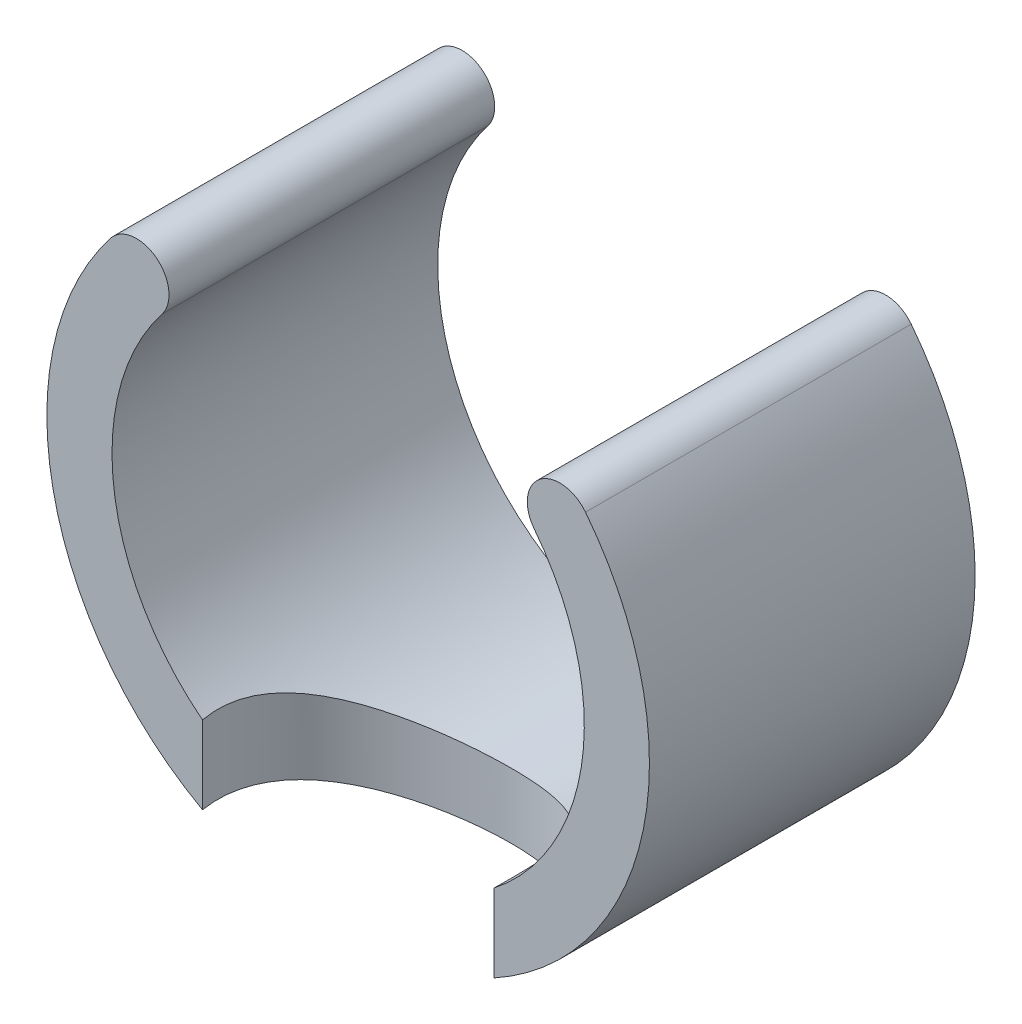
ISO-10303-21;
HEADER;
FILE_DESCRIPTION(('STEP AP214'),'2;1');
FILE_NAME('part.step','',(''),(''),'','','');
FILE_SCHEMA(('AUTOMOTIVE_DESIGN { 1 0 10303 214 1 1 1 1 }'));
ENDSEC;
DATA;
#1=APPLICATION_CONTEXT('core data for automotive mechanical design processes');
#2=APPLICATION_PROTOCOL_DEFINITION('international standard','automotive_design',2000,#1);
#3=PRODUCT_CONTEXT('',#1,'mechanical');
#4=PRODUCT('Part','Part','',(#3));
#5=PRODUCT_RELATED_PRODUCT_CATEGORY('part','',(#4));
#6=PRODUCT_DEFINITION_FORMATION('','',#4);
#7=PRODUCT_DEFINITION_CONTEXT('part definition',#1,'design');
#8=PRODUCT_DEFINITION('design','',#6,#7);
#9=PRODUCT_DEFINITION_SHAPE('','',#8);
#10=(LENGTH_UNIT() NAMED_UNIT(*) SI_UNIT(.MILLI.,.METRE.));
#11=(NAMED_UNIT(*) PLANE_ANGLE_UNIT() SI_UNIT($,.RADIAN.));
#12=(NAMED_UNIT(*) SI_UNIT($,.STERADIAN.) SOLID_ANGLE_UNIT());
#13=UNCERTAINTY_MEASURE_WITH_UNIT(LENGTH_MEASURE(1.E-05),#10,'distance_accuracy_value','');
#14=(GEOMETRIC_REPRESENTATION_CONTEXT(3) GLOBAL_UNCERTAINTY_ASSIGNED_CONTEXT((#13)) GLOBAL_UNIT_ASSIGNED_CONTEXT((#10,
#11,#12)) REPRESENTATION_CONTEXT('',''));
#15=CARTESIAN_POINT('',(0.,0.,0.));
#16=DIRECTION('',(0.,0.,1.));
#17=DIRECTION('',(1.,0.,0.));
#18=AXIS2_PLACEMENT_3D('',#15,#16,#17);
#19=CARTESIAN_POINT('',(-3.25,2.5403001791127,10.));
#20=DIRECTION('',(0.,0.,-1.));
#21=DIRECTION('',(-1.,0.,0.));
#22=AXIS2_PLACEMENT_3D('',#19,#20,#21);
#23=PLANE('',#22);
#24=CARTESIAN_POINT('',(0.,0.,10.));
#25=DIRECTION('',(0.,0.,-1.));
#26=DIRECTION('',(1.,0.,0.));
#27=AXIS2_PLACEMENT_3D('',#24,#25,#26);
#28=CIRCLE('',#27,7.25);
#29=CARTESIAN_POINT('',(5.71212121212121,4.46477001177383,10.));
#30=VERTEX_POINT('',#29);
#31=CARTESIAN_POINT('',(4.47213595499958,-5.70635610525667,10.));
#32=VERTEX_POINT('',#31);
#33=EDGE_CURVE('E116',#30,#32,#28,.T.);
#34=ORIENTED_EDGE('',*,*,#33,.T.);
#35=DIRECTION('',(0.,-1.,0.));
#36=VECTOR('',#35,1.);
#37=CARTESIAN_POINT('',(4.47213595499958,6.0806003582254,10.));
#38=LINE('',#37,#36);
#39=CARTESIAN_POINT('',(4.47213595499958,-8.09706737035083,10.));
#40=VERTEX_POINT('',#39);
#41=EDGE_CURVE('E11',#32,#40,#38,.T.);
#42=ORIENTED_EDGE('',*,*,#41,.T.);
#43=CARTESIAN_POINT('',(0.,0.,10.));
#44=DIRECTION('',(0.,0.,1.));
#45=DIRECTION('',(1.,0.,0.));
#46=AXIS2_PLACEMENT_3D('',#43,#44,#45);
#47=CIRCLE('',#46,9.25);
#48=CARTESIAN_POINT('',(7.28787878787879,5.69643070467696,10.));
#49=VERTEX_POINT('',#48);
#50=EDGE_CURVE('E104',#40,#49,#47,.T.);
#51=ORIENTED_EDGE('',*,*,#50,.T.);
#52=CARTESIAN_POINT('',(6.5,5.0806003582254,10.));
#53=DIRECTION('',(0.,0.,1.));
#54=DIRECTION('',(1.,0.,0.));
#55=AXIS2_PLACEMENT_3D('',#52,#53,#54);
#56=CIRCLE('',#55,1.);
#57=EDGE_CURVE('E111',#49,#30,#56,.T.);
#58=ORIENTED_EDGE('',*,*,#57,.T.);
#59=EDGE_LOOP('',(#34,#42,#51,#58));
#60=FACE_BOUND('',#59,.T.);
#61=ADVANCED_FACE('F37',(#60),#23,.F.);
#62=CARTESIAN_POINT('',(-6.5,5.0806003582254,10.));
#63=DIRECTION('',(0.,0.,-1.));
#64=DIRECTION('',(-1.,0.,0.));
#65=AXIS2_PLACEMENT_3D('',#62,#63,#64);
#66=CYLINDRICAL_SURFACE('',#65,1.);
#67=CARTESIAN_POINT('',(-6.5,5.0806003582254,0.));
#68=DIRECTION('',(0.,0.,1.));
#69=DIRECTION('',(-1.,0.,0.));
#70=AXIS2_PLACEMENT_3D('',#67,#68,#69);
#71=CIRCLE('',#70,1.);
#72=CARTESIAN_POINT('',(-5.71212121212121,4.46477001177383,0.));
#73=VERTEX_POINT('',#72);
#74=CARTESIAN_POINT('',(-7.28787878787879,5.69643070467696,0.));
#75=VERTEX_POINT('',#74);
#76=EDGE_CURVE('E105',#73,#75,#71,.T.);
#77=ORIENTED_EDGE('',*,*,#76,.T.);
#78=DIRECTION('',(0.,0.,-1.));
#79=VECTOR('',#78,1.);
#80=CARTESIAN_POINT('',(-7.28787878787879,5.69643070467696,10.));
#81=LINE('',#80,#79);
#82=CARTESIAN_POINT('',(-7.28787878787879,5.69643070467696,10.));
#83=VERTEX_POINT('',#82);
#84=EDGE_CURVE('E100',#83,#75,#81,.T.);
#85=ORIENTED_EDGE('',*,*,#84,.F.);
#86=CARTESIAN_POINT('',(-6.5,5.0806003582254,10.));
#87=DIRECTION('',(0.,0.,1.));
#88=DIRECTION('',(-1.,0.,0.));
#89=AXIS2_PLACEMENT_3D('',#86,#87,#88);
#90=CIRCLE('',#89,1.);
#91=CARTESIAN_POINT('',(-5.71212121212121,4.46477001177383,10.));
#92=VERTEX_POINT('',#91);
#93=EDGE_CURVE('E109',#92,#83,#90,.T.);
#94=ORIENTED_EDGE('',*,*,#93,.F.);
#95=DIRECTION('',(0.,0.,-1.));
#96=VECTOR('',#95,1.);
#97=CARTESIAN_POINT('',(-5.71212121212121,4.46477001177383,10.));
#98=LINE('',#97,#96);
#99=EDGE_CURVE('E119',#92,#73,#98,.T.);
#100=ORIENTED_EDGE('',*,*,#99,.T.);
#101=EDGE_LOOP('',(#77,#85,#94,#100));
#102=FACE_BOUND('',#101,.T.);
#103=ADVANCED_FACE('F39',(#102),#66,.T.);
#104=CARTESIAN_POINT('',(0.,0.,10.));
#105=DIRECTION('',(0.,0.,-1.));
#106=DIRECTION('',(-1.,0.,0.));
#107=AXIS2_PLACEMENT_3D('',#104,#105,#106);
#108=CYLINDRICAL_SURFACE('',#107,9.25);
#109=ORIENTED_EDGE('',*,*,#50,.F.);
#110=CARTESIAN_POINT('',(4.47213595499958,-8.09706737035083,10.));
#111=CARTESIAN_POINT('',(4.48489758006888,-8.08999882609131,9.88604254475511));
#112=CARTESIAN_POINT('',(4.49327965414798,-8.08534917688268,9.77144470022145));
#113=CARTESIAN_POINT('',(4.50126465970609,-8.08091732281667,9.54188039251851));
#114=CARTESIAN_POINT('',(4.5008699393526,-8.08113381605844,9.42691403617188));
#115=CARTESIAN_POINT('',(4.49131206083086,-8.08644680427386,9.19803520379959));
#116=CARTESIAN_POINT('',(4.48219265001421,-8.09151895209911,9.08412033140435));
#117=CARTESIAN_POINT('',(4.45537290876027,-8.1063179996134,8.85761605176528));
#118=CARTESIAN_POINT('',(4.43767249401744,-8.11604494503427,8.74502665755497));
#119=CARTESIAN_POINT('',(4.39391702856915,-8.1398163520152,8.5220490745522));
#120=CARTESIAN_POINT('',(4.36786917475545,-8.15385709393059,8.41165907627824));
#121=CARTESIAN_POINT('',(4.30769978982687,-8.18580334131056,8.19365865801574));
#122=CARTESIAN_POINT('',(4.27357512516452,-8.20371034652586,8.0860493348591));
#123=CARTESIAN_POINT('',(4.15951053821454,-8.26246523313206,7.76821147283342));
#124=CARTESIAN_POINT('',(4.06788213577147,-8.30834577312544,7.56298364529098));
#125=CARTESIAN_POINT('',(3.85053523659749,-8.41136413706981,7.15930372860976));
#126=CARTESIAN_POINT('',(3.72321939088373,-8.46898221170473,6.96184459338603));
#127=CARTESIAN_POINT('',(3.44015728464322,-8.5878649366188,6.58966619799807));
#128=CARTESIAN_POINT('',(3.28439652750061,-8.64913143549607,6.41495861102613));
#129=CARTESIAN_POINT('',(2.9293230165855,-8.77613795751267,6.07426012902534));
#130=CARTESIAN_POINT('',(2.72714973826912,-8.84166846450466,5.91113101947199));
#131=CARTESIAN_POINT('',(2.40388601416002,-8.93288673380512,5.69365431364808));
#132=CARTESIAN_POINT('',(2.29273082970407,-8.96212737206574,5.6256683499567));
#133=CARTESIAN_POINT('',(2.06435598221837,-9.01746646503543,5.49932088563788));
#134=CARTESIAN_POINT('',(1.94713932686477,-9.04356645713101,5.44095467080456));
#135=CARTESIAN_POINT('',(1.7097107319425,-9.09141225682448,5.3354540310262));
#136=CARTESIAN_POINT('',(1.58960056425818,-9.11323251197354,5.28812421444321));
#137=CARTESIAN_POINT('',(1.34516245979946,-9.15250497663014,5.20381102315654));
#138=CARTESIAN_POINT('',(1.22083656057016,-9.16995926306569,5.16682272791444));
#139=CARTESIAN_POINT('',(0.968947584015276,-9.1999848152553,5.10363860089762));
#140=CARTESIAN_POINT('',(0.841385929489183,-9.21255818887082,5.07743811002562));
#141=CARTESIAN_POINT('',(0.584073397738918,-9.23244291462036,5.03616409855269));
#142=CARTESIAN_POINT('',(0.454322738884087,-9.2397547884882,5.02108947469958));
#143=CARTESIAN_POINT('',(0.206293780403961,-9.24845063983486,5.0031798464544));
#144=CARTESIAN_POINT('',(0.0881063694657602,-9.25033511163145,4.9993112400217));
#145=CARTESIAN_POINT('',(-0.148233404857098,-9.24956717836308,5.00088961000329));
#146=CARTESIAN_POINT('',(-0.266385744268939,-9.24691329460922,5.00633962261384));
#147=CARTESIAN_POINT('',(-0.501650619846853,-9.23713713130681,5.02649136222737));
#148=CARTESIAN_POINT('',(-0.618763639467164,-9.230017053134,5.04118853134156));
#149=CARTESIAN_POINT('',(-0.85118565718089,-9.21149180783341,5.07966460262621));
#150=CARTESIAN_POINT('',(-0.966493955265756,-9.20008501889577,5.1034469420849));
#151=CARTESIAN_POINT('',(-1.19087392592476,-9.17369458835386,5.15894597007197));
#152=CARTESIAN_POINT('',(-1.3000277169505,-9.15883460127138,5.19038986362034));
#153=CARTESIAN_POINT('',(-1.51519967791583,-9.12570790686383,5.26124802855908));
#154=CARTESIAN_POINT('',(-1.6212167466451,-9.10744001918902,5.30066506190102));
#155=CARTESIAN_POINT('',(-1.9335945003063,-9.04812116348833,5.43036067253048));
#156=CARTESIAN_POINT('',(-2.13445461686193,-9.00253372771635,5.53212702777125));
#157=CARTESIAN_POINT('',(-2.53039979691018,-8.89968208304902,5.77116074421674));
#158=CARTESIAN_POINT('',(-2.72413828442333,-8.84183054143739,5.91038789964362));
#159=CARTESIAN_POINT('',(-3.08663868757161,-8.72190684654523,6.21684911347673));
#160=CARTESIAN_POINT('',(-3.25538352106138,-8.65983184860582,6.38410216155728));
#161=CARTESIAN_POINT('',(-3.57844740774304,-8.53170585408679,6.75934833749651));
#162=CARTESIAN_POINT('',(-3.73019412590928,-8.46578506548172,6.9696303856932));
#163=CARTESIAN_POINT('',(-3.92970069381427,-8.37408743899456,7.30356393606012));
#164=CARTESIAN_POINT('',(-3.99154679390264,-8.34470289744326,7.4180366341937));
#165=CARTESIAN_POINT('',(-4.10535056197327,-8.28930603657504,7.65255460179983));
#166=CARTESIAN_POINT('',(-4.15731331434438,-8.26329198555109,7.77259696625894));
#167=CARTESIAN_POINT('',(-4.24996027429379,-8.21602084904903,8.01527658763121));
#168=CARTESIAN_POINT('',(-4.29083258176016,-8.1946857864363,8.13782682312317));
#169=CARTESIAN_POINT('',(-4.36201569440226,-8.15701799991444,8.38664965219971));
#170=CARTESIAN_POINT('',(-4.39233220532143,-8.14068257412229,8.51292019467874));
#171=CARTESIAN_POINT('',(-4.44196101644163,-8.11370954803898,8.76799187359897));
#172=CARTESIAN_POINT('',(-4.46129133779871,-8.10306261837334,8.89678850517966));
#173=CARTESIAN_POINT('',(-4.48871106628602,-8.08790575866285,9.15586943414633));
#174=CARTESIAN_POINT('',(-4.49680734111596,-8.08339207921857,9.28615277350081));
#175=CARTESIAN_POINT('',(-4.5010350587087,-8.08103895534727,9.51406614366662));
#176=CARTESIAN_POINT('',(-4.49966900567461,-8.08180339651884,9.61164495716267));
#177=CARTESIAN_POINT('',(-4.49062151342671,-8.08682908994844,9.80629804118089));
#178=CARTESIAN_POINT('',(-4.48294789452147,-8.09108601211185,9.90337278676397));
#179=CARTESIAN_POINT('',(-4.47213595499958,-8.09706737035083,10.));
#180=B_SPLINE_CURVE_WITH_KNOTS('',3,(#110,#111,#112,#113,#114,#115,#116,#117,#118,#119,#120,
#121,#122,#123,#124,#125,#126,#127,#128,#129,#130,#131,#132,#133,#134,#135,#136,#137,#138,#139,
#140,#141,#142,#143,#144,#145,#146,#147,#148,#149,#150,#151,#152,#153,#154,#155,#156,#157,#158,
#159,#160,#161,#162,#163,#164,#165,#166,#167,#168,#169,#170,#171,#172,#173,#174,#175,#176,#177,
#178,#179),.UNSPECIFIED.,.F.,.F.,(4,2,2,2,2,2,2,2,2,2,2,2,2,2,2,2,2,2,2,2,2,2,2,2,2,2,2,2,2,2,2,
2,2,2,4),(0.,0.344553588946533,0.689014996195983,1.03175820783599,1.37450478688341,
1.71695665236772,2.0595415967713,2.74474374509819,3.46761973334347,4.19086516022898,
4.99037545093835,5.3905710108695,5.79056986606612,6.18283274947934,6.57490867373586,
6.96681508798233,7.35868263517121,7.7130345807285,8.06750200338289,8.42179484709775,
8.77622186712573,9.11951206032062,9.46292137592902,10.1492076655085,10.882679491147,
11.6166503243966,12.415145802642,12.8148876505698,13.2144232957968,13.6066855827062,
13.9987355090197,14.3901404676642,14.7813060434833,15.0738228464889,15.365977524488),.UNSPECIFIED.);
#181=CARTESIAN_POINT('',(-4.47213595499958,-8.09706737035083,10.));
#182=VERTEX_POINT('',#181);
#183=EDGE_CURVE('E99',#40,#182,#180,.T.);
#184=ORIENTED_EDGE('',*,*,#183,.T.);
#185=EDGE_CURVE('E90',#83,#182,#47,.T.);
#186=ORIENTED_EDGE('',*,*,#185,.F.);
#187=ORIENTED_EDGE('',*,*,#84,.T.);
#188=CARTESIAN_POINT('',(0.,0.,0.));
#189=DIRECTION('',(0.,0.,1.));
#190=DIRECTION('',(1.,0.,0.));
#191=AXIS2_PLACEMENT_3D('',#188,#189,#190);
#192=CIRCLE('',#191,9.25);
#193=CARTESIAN_POINT('',(7.28787878787879,5.69643070467696,0.));
#194=VERTEX_POINT('',#193);
#195=EDGE_CURVE('E122',#75,#194,#192,.T.);
#196=ORIENTED_EDGE('',*,*,#195,.T.);
#197=DIRECTION('',(0.,0.,-1.));
#198=VECTOR('',#197,1.);
#199=CARTESIAN_POINT('',(7.28787878787879,5.69643070467696,10.));
#200=LINE('',#199,#198);
#201=EDGE_CURVE('E130',#49,#194,#200,.T.);
#202=ORIENTED_EDGE('',*,*,#201,.F.);
#203=EDGE_LOOP('',(#109,#184,#186,#187,#196,#202));
#204=FACE_BOUND('',#203,.T.);
#205=ADVANCED_FACE('F102',(#204),#108,.T.);
#206=CARTESIAN_POINT('',(6.5,5.0806003582254,10.));
#207=DIRECTION('',(0.,0.,-1.));
#208=DIRECTION('',(-1.,0.,0.));
#209=AXIS2_PLACEMENT_3D('',#206,#207,#208);
#210=CYLINDRICAL_SURFACE('',#209,1.);
#211=CARTESIAN_POINT('',(6.5,5.0806003582254,0.));
#212=DIRECTION('',(0.,0.,1.));
#213=DIRECTION('',(1.,0.,0.));
#214=AXIS2_PLACEMENT_3D('',#211,#212,#213);
#215=CIRCLE('',#214,1.);
#216=CARTESIAN_POINT('',(5.71212121212121,4.46477001177383,0.));
#217=VERTEX_POINT('',#216);
#218=EDGE_CURVE('E124',#194,#217,#215,.T.);
#219=ORIENTED_EDGE('',*,*,#218,.T.);
#220=DIRECTION('',(0.,0.,-1.));
#221=VECTOR('',#220,1.);
#222=CARTESIAN_POINT('',(5.71212121212121,4.46477001177383,10.));
#223=LINE('',#222,#221);
#224=EDGE_CURVE('E128',#30,#217,#223,.T.);
#225=ORIENTED_EDGE('',*,*,#224,.F.);
#226=ORIENTED_EDGE('',*,*,#57,.F.);
#227=ORIENTED_EDGE('',*,*,#201,.T.);
#228=EDGE_LOOP('',(#219,#225,#226,#227));
#229=FACE_BOUND('',#228,.T.);
#230=ADVANCED_FACE('F140',(#229),#210,.T.);
#231=CARTESIAN_POINT('',(0.,0.,10.));
#232=DIRECTION('',(0.,0.,-1.));
#233=DIRECTION('',(-1.,0.,0.));
#234=AXIS2_PLACEMENT_3D('',#231,#232,#233);
#235=CYLINDRICAL_SURFACE('',#234,7.25);
#236=CARTESIAN_POINT('',(-4.47213595499958,-5.70635610525667,10.));
#237=VERTEX_POINT('',#236);
#238=EDGE_CURVE('E60',#237,#92,#28,.T.);
#239=ORIENTED_EDGE('',*,*,#238,.F.);
#240=CARTESIAN_POINT('',(-4.47213595499958,-5.70635610525667,10.));
#241=CARTESIAN_POINT('',(-4.48398909785629,-5.69704039574313,9.89419976904961));
#242=CARTESIAN_POINT('',(-4.49206963353615,-5.69067302227324,9.78771349888954));
#243=CARTESIAN_POINT('',(-4.5006469841967,-5.68390599261695,9.57429186515644));
#244=CARTESIAN_POINT('',(-4.50114694973914,-5.68350385721868,9.46735670663086));
#245=CARTESIAN_POINT('',(-4.4945602768735,-5.6887101681761,9.25470095909474));
#246=CARTESIAN_POINT('',(-4.48753260529114,-5.69427189769223,9.14897739176627));
#247=CARTESIAN_POINT('',(-4.46611169265376,-5.71108885004536,8.93874316320576));
#248=CARTESIAN_POINT('',(-4.45171831238522,-5.72234418049263,8.83423252493652));
#249=CARTESIAN_POINT('',(-4.4158182689262,-5.75009213404594,8.62732832853382));
#250=CARTESIAN_POINT('',(-4.39432306491381,-5.76657631841323,8.52493164039457));
#251=CARTESIAN_POINT('',(-4.34450835278877,-5.80419830794992,8.32266842853492));
#252=CARTESIAN_POINT('',(-4.31618599853639,-5.82533805363683,8.22280297929073));
#253=CARTESIAN_POINT('',(-4.22137737794299,-5.89479701397203,7.92751544589155));
#254=CARTESIAN_POINT('',(-4.14507996547078,-5.94913110893046,7.73657344250146));
#255=CARTESIAN_POINT('',(-3.96184216034987,-6.07284367835326,7.35470605816767));
#256=CARTESIAN_POINT('',(-3.85292598994643,-6.14308230709347,7.16502514872392));
#257=CARTESIAN_POINT('',(-3.61006602357188,-6.28888255241678,6.80469153344489));
#258=CARTESIAN_POINT('',(-3.47610820067133,-6.36444713745117,6.63404957812815));
#259=CARTESIAN_POINT('',(-3.15586616361067,-6.53004495786563,6.28164855114695));
#260=CARTESIAN_POINT('',(-2.96447330698722,-6.61997453212372,6.10440011252143));
#261=CARTESIAN_POINT('',(-2.65471631278859,-6.747410278381,5.86412201644022));
#262=CARTESIAN_POINT('',(-2.54759975572194,-6.78867308012564,5.78824917665164));
#263=CARTESIAN_POINT('',(-2.32623526875953,-6.86767094705698,5.64565987912913));
#264=CARTESIAN_POINT('',(-2.2119911696736,-6.90540788049602,5.57893856340299));
#265=CARTESIAN_POINT('',(-1.97755068421846,-6.97615324888361,5.45565250251306));
#266=CARTESIAN_POINT('',(-1.85738778514708,-7.00918491470235,5.39903748249362));
#267=CARTESIAN_POINT('',(-1.61139663550741,-7.06979000028257,5.2962930686147));
#268=CARTESIAN_POINT('',(-1.48557151970775,-7.09736639569739,5.25015795629561));
#269=CARTESIAN_POINT('',(-1.22930645564389,-7.14620891383148,5.16908231052082));
#270=CARTESIAN_POINT('',(-1.09887122698932,-7.16748129218959,5.13413067664603));
#271=CARTESIAN_POINT('',(-0.834481070814733,-7.2030492790127,5.07598030831138));
#272=CARTESIAN_POINT('',(-0.700526854042544,-7.21734628508387,5.05277921944216));
#273=CARTESIAN_POINT('',(-0.45031853828386,-7.23692456031561,5.02108215045627));
#274=CARTESIAN_POINT('',(-0.334350619961061,-7.24322074797865,5.0109282484808));
#275=CARTESIAN_POINT('',(-0.101811971580994,-7.25021784315187,4.99964673127316));
#276=CARTESIAN_POINT('',(0.01475869821197,-7.25091929960972,4.99851823048048));
#277=CARTESIAN_POINT('',(0.247505589390371,-7.2467086940957,5.00530383421412));
#278=CARTESIAN_POINT('',(0.36368189364603,-7.24179789547004,5.01321590366355));
#279=CARTESIAN_POINT('',(0.594711733640773,-7.22649438990957,5.03795838258125));
#280=CARTESIAN_POINT('',(0.709565285637042,-7.21610175042253,5.05478868232093));
#281=CARTESIAN_POINT('',(0.92882912713853,-7.19103996339424,5.09559359481929));
#282=CARTESIAN_POINT('',(1.03339416722699,-7.17673426190268,5.11896381426395));
#283=CARTESIAN_POINT('',(1.23999543531658,-7.14393959544293,5.17289633127016));
#284=CARTESIAN_POINT('',(1.3420308053674,-7.12544923219101,5.20346103296895));
#285=CARTESIAN_POINT('',(1.64339664527864,-7.06425120326562,5.30546262653398));
#286=CARTESIAN_POINT('',(1.8381699000194,-7.01579473549061,5.38724170259203));
#287=CARTESIAN_POINT('',(2.22581021401059,-6.90305201206065,5.58254483394705));
#288=CARTESIAN_POINT('',(2.41742186106844,-6.83784648498414,5.69800024056074));
#289=CARTESIAN_POINT('',(2.77959693625023,-6.69880729980343,5.95414322188627));
#290=CARTESIAN_POINT('',(2.95014173508898,-6.62496611597298,6.09485286288867));
#291=CARTESIAN_POINT('',(3.29134199930923,-6.46298752585156,6.42094222770475));
#292=CARTESIAN_POINT('',(3.45839654557162,-6.37433420692296,6.60984307977767));
#293=CARTESIAN_POINT('',(3.75956762633025,-6.20147563631949,7.014192521276));
#294=CARTESIAN_POINT('',(3.89368147554228,-6.11727074771395,7.2296432728674));
#295=CARTESIAN_POINT('',(4.10854971752691,-5.97465555436901,7.65141124243841));
#296=CARTESIAN_POINT('',(4.19422382826513,-5.91427522214584,7.85451432129346));
#297=CARTESIAN_POINT('',(4.30027335685967,-5.83712681047103,8.16961449395131));
#298=CARTESIAN_POINT('',(4.33186217188744,-5.8136620175434,8.27629324413979));
#299=CARTESIAN_POINT('',(4.38721846044471,-5.77200295816844,8.49264581004097));
#300=CARTESIAN_POINT('',(4.41098986439618,-5.75380604370052,8.60231809054058));
#301=CARTESIAN_POINT('',(4.44928731611426,-5.72423777073637,8.81795884052719));
#302=CARTESIAN_POINT('',(4.46424314322728,-5.71255100539123,8.92380769723795));
#303=CARTESIAN_POINT('',(4.48659539765911,-5.69501181124592,9.13678322524977));
#304=CARTESIAN_POINT('',(4.49399233320753,-5.68915899019534,9.24390981015146));
#305=CARTESIAN_POINT('',(4.50112045262414,-5.68352523064983,9.45953227671338));
#306=CARTESIAN_POINT('',(4.50078287986353,-5.68379875236589,9.56803186336811));
#307=CARTESIAN_POINT('',(4.49230657464882,-5.69048548792094,9.78458992647748));
#308=CARTESIAN_POINT('',(4.48416400338631,-5.69690172298855,9.89264815959152));
#309=CARTESIAN_POINT('',(4.47213595499958,-5.70635610525667,10.));
#310=B_SPLINE_CURVE_WITH_KNOTS('',3,(#240,#241,#242,#243,#244,#245,#246,#247,#248,#249,#250,
#251,#252,#253,#254,#255,#256,#257,#258,#259,#260,#261,#262,#263,#264,#265,#266,#267,#268,#269,
#270,#271,#272,#273,#274,#275,#276,#277,#278,#279,#280,#281,#282,#283,#284,#285,#286,#287,#288,
#289,#290,#291,#292,#293,#294,#295,#296,#297,#298,#299,#300,#301,#302,#303,#304,#305,#306,#307,
#308,#309),.UNSPECIFIED.,.F.,.F.,(4,2,2,2,2,2,2,2,2,2,2,2,2,2,2,2,2,2,2,2,2,2,2,2,2,2,2,2,2,2,2,
2,2,2,4),(0.,0.32050548800611,0.640877767030805,0.958758678002566,1.27664559721581,
1.59402207343035,1.91153108880651,2.54707029629166,3.23388972992675,3.92109504038001,
4.74463417005494,5.15700471129748,5.56915549560971,5.97919509884572,6.38901041978818,
6.79841769809419,7.20774291262784,7.55702061125686,7.90626403879573,8.25542886540423,
8.60458939604012,8.92850989924563,9.2525387990868,9.90004017368902,10.5964534962335,
11.2934783100112,12.092012322236,12.8906114083614,13.573284230805,13.9140390201595,
14.2546222226494,14.5768217077958,14.8989995281127,15.2240424802953,15.5492453835929),.UNSPECIFIED.);
#311=EDGE_CURVE('E52',#237,#32,#310,.T.);
#312=ORIENTED_EDGE('',*,*,#311,.T.);
#313=ORIENTED_EDGE('',*,*,#33,.F.);
#314=ORIENTED_EDGE('',*,*,#224,.T.);
#315=CARTESIAN_POINT('',(0.,0.,0.));
#316=DIRECTION('',(0.,0.,-1.));
#317=DIRECTION('',(1.,0.,0.));
#318=AXIS2_PLACEMENT_3D('',#315,#316,#317);
#319=CIRCLE('',#318,7.25);
#320=EDGE_CURVE('E82',#217,#73,#319,.T.);
#321=ORIENTED_EDGE('',*,*,#320,.T.);
#322=ORIENTED_EDGE('',*,*,#99,.F.);
#323=EDGE_LOOP('',(#239,#312,#313,#314,#321,#322));
#324=FACE_BOUND('',#323,.T.);
#325=ADVANCED_FACE('F143',(#324),#235,.F.);
#326=ORIENTED_EDGE('',*,*,#185,.T.);
#327=DIRECTION('',(0.,-1.,0.));
#328=VECTOR('',#327,1.);
#329=CARTESIAN_POINT('',(-4.47213595499958,6.0806003582254,10.));
#330=LINE('',#329,#328);
#331=EDGE_CURVE('E45',#182,#237,#330,.F.);
#332=ORIENTED_EDGE('',*,*,#331,.T.);
#333=ORIENTED_EDGE('',*,*,#238,.T.);
#334=ORIENTED_EDGE('',*,*,#93,.T.);
#335=EDGE_LOOP('',(#326,#332,#333,#334));
#336=FACE_BOUND('',#335,.T.);
#337=ADVANCED_FACE('F107',(#336),#23,.F.);
#338=CARTESIAN_POINT('',(-3.25,2.5403001791127,0.));
#339=DIRECTION('',(0.,0.,-1.));
#340=DIRECTION('',(-1.,0.,0.));
#341=AXIS2_PLACEMENT_3D('',#338,#339,#340);
#342=PLANE('',#341);
#343=ORIENTED_EDGE('',*,*,#76,.F.);
#344=ORIENTED_EDGE('',*,*,#320,.F.);
#345=ORIENTED_EDGE('',*,*,#218,.F.);
#346=ORIENTED_EDGE('',*,*,#195,.F.);
#347=EDGE_LOOP('',(#343,#344,#345,#346));
#348=FACE_BOUND('',#347,.T.);
#349=ADVANCED_FACE('F136',(#348),#342,.T.);
#350=CARTESIAN_POINT('',(0.,6.0806003582254,9.5));
#351=DIRECTION('',(0.,-1.,0.));
#352=DIRECTION('',(0.,0.,-1.));
#353=AXIS2_PLACEMENT_3D('',#350,#351,#352);
#354=CYLINDRICAL_SURFACE('',#353,4.5);
#355=ORIENTED_EDGE('',*,*,#311,.F.);
#356=ORIENTED_EDGE('',*,*,#331,.F.);
#357=ORIENTED_EDGE('',*,*,#183,.F.);
#358=ORIENTED_EDGE('',*,*,#41,.F.);
#359=EDGE_LOOP('',(#355,#356,#357,#358));
#360=FACE_BOUND('',#359,.T.);
#361=ADVANCED_FACE('F98',(#360),#354,.F.);
#362=CLOSED_SHELL('',(#61,#103,#205,#230,#325,#337,#349,#361));
#363=MANIFOLD_SOLID_BREP('B2',#362);
#364=ADVANCED_BREP_SHAPE_REPRESENTATION('',(#18,#363),#14);
#365=SHAPE_DEFINITION_REPRESENTATION(#9,#364);
ENDSEC;
END-ISO-10303-21;
